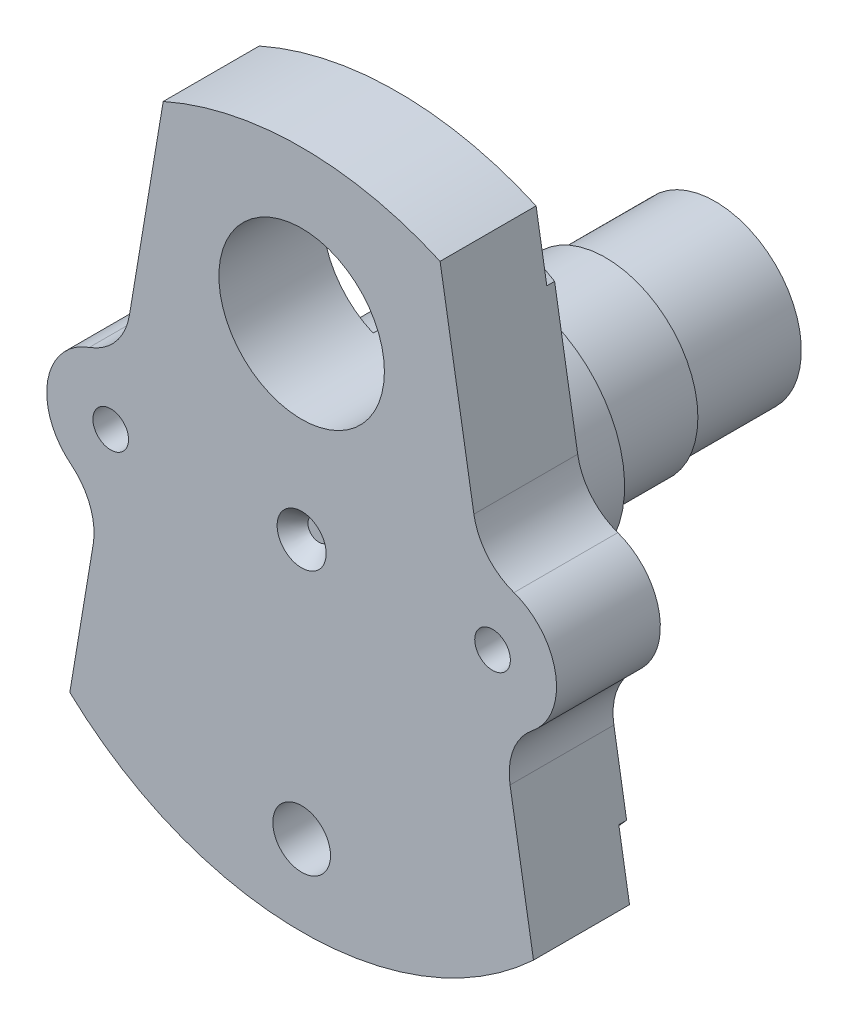
ISO-10303-21;
HEADER;
FILE_DESCRIPTION(('STEP AP214'),'2;1');
FILE_NAME('part.step','',(''),(''),'','','');
FILE_SCHEMA(('AUTOMOTIVE_DESIGN { 1 0 10303 214 1 1 1 1 }'));
ENDSEC;
DATA;
#1=APPLICATION_CONTEXT('core data for automotive mechanical design processes');
#2=APPLICATION_PROTOCOL_DEFINITION('international standard','automotive_design',2000,#1);
#3=PRODUCT_CONTEXT('',#1,'mechanical');
#4=PRODUCT('Part','Part','',(#3));
#5=PRODUCT_RELATED_PRODUCT_CATEGORY('part','',(#4));
#6=PRODUCT_DEFINITION_FORMATION('','',#4);
#7=PRODUCT_DEFINITION_CONTEXT('part definition',#1,'design');
#8=PRODUCT_DEFINITION('design','',#6,#7);
#9=PRODUCT_DEFINITION_SHAPE('','',#8);
#10=(LENGTH_UNIT() NAMED_UNIT(*) SI_UNIT(.MILLI.,.METRE.));
#11=(NAMED_UNIT(*) PLANE_ANGLE_UNIT() SI_UNIT($,.RADIAN.));
#12=(NAMED_UNIT(*) SI_UNIT($,.STERADIAN.) SOLID_ANGLE_UNIT());
#13=UNCERTAINTY_MEASURE_WITH_UNIT(LENGTH_MEASURE(1.E-05),#10,'distance_accuracy_value','');
#14=(GEOMETRIC_REPRESENTATION_CONTEXT(3) GLOBAL_UNCERTAINTY_ASSIGNED_CONTEXT((#13)) GLOBAL_UNIT_ASSIGNED_CONTEXT((#10,
#11,#12)) REPRESENTATION_CONTEXT('',''));
#15=CARTESIAN_POINT('',(0.,0.,0.));
#16=DIRECTION('',(0.,0.,1.));
#17=DIRECTION('',(1.,0.,0.));
#18=AXIS2_PLACEMENT_3D('',#15,#16,#17);
#19=CARTESIAN_POINT('',(36.1365206861808,-18.7744784222295,-18.));
#20=DIRECTION('',(0.986305164893653,0.164930657259661,0.));
#21=DIRECTION('',(-0.164930657259661,0.986305164893653,0.));
#22=AXIS2_PLACEMENT_3D('',#19,#20,#21);
#23=PLANE('',#22);
#24=DIRECTION('',(0.,0.,1.));
#25=VECTOR('',#24,1.);
#26=CARTESIAN_POINT('',(40.1957522810744,-43.0491715209165,-18.));
#27=LINE('',#26,#25);
#28=CARTESIAN_POINT('',(40.1957522810744,-43.0491715209165,-16.65));
#29=VERTEX_POINT('',#28);
#30=CARTESIAN_POINT('',(40.1957522810744,-43.0491715209165,0.));
#31=VERTEX_POINT('',#30);
#32=EDGE_CURVE('E335',#29,#31,#27,.T.);
#33=ORIENTED_EDGE('',*,*,#32,.F.);
#34=DIRECTION('',(-0.164930657259661,0.986305164893653,0.));
#35=VECTOR('',#34,1.);
#36=CARTESIAN_POINT('',(36.1365206861808,-18.7744784222295,-16.65));
#37=LINE('',#36,#35);
#38=CARTESIAN_POINT('',(38.3431689216786,-31.9705002409534,-16.65));
#39=VERTEX_POINT('',#38);
#40=EDGE_CURVE('E213',#29,#39,#37,.T.);
#41=ORIENTED_EDGE('',*,*,#40,.T.);
#42=DIRECTION('',(0.,0.,-1.));
#43=VECTOR('',#42,1.);
#44=CARTESIAN_POINT('',(38.3431689216786,-31.9705002409534,-16.65));
#45=LINE('',#44,#43);
#46=CARTESIAN_POINT('',(38.3431689216787,-31.9705002409534,-18.));
#47=VERTEX_POINT('',#46);
#48=EDGE_CURVE('E387',#39,#47,#45,.T.);
#49=ORIENTED_EDGE('',*,*,#48,.T.);
#50=DIRECTION('',(-0.164930657259661,0.986305164893653,0.));
#51=VECTOR('',#50,1.);
#52=CARTESIAN_POINT('',(36.1365206861808,-18.7744784222295,-18.));
#53=LINE('',#52,#51);
#54=CARTESIAN_POINT('',(36.1365206861808,-18.7744784222295,-18.));
#55=VERTEX_POINT('',#54);
#56=EDGE_CURVE('E294',#47,#55,#53,.T.);
#57=ORIENTED_EDGE('',*,*,#56,.T.);
#58=DIRECTION('',(0.,0.,1.));
#59=VECTOR('',#58,1.);
#60=CARTESIAN_POINT('',(36.1365206861808,-18.7744784222295,-18.));
#61=LINE('',#60,#59);
#62=CARTESIAN_POINT('',(36.1365206861808,-18.7744784222295,0.));
#63=VERTEX_POINT('',#62);
#64=EDGE_CURVE('E245',#55,#63,#61,.T.);
#65=ORIENTED_EDGE('',*,*,#64,.T.);
#66=DIRECTION('',(-0.164930657259661,0.986305164893653,0.));
#67=VECTOR('',#66,1.);
#68=CARTESIAN_POINT('',(36.1365206861808,-18.7744784222295,0.));
#69=LINE('',#68,#67);
#70=EDGE_CURVE('E271',#31,#63,#69,.T.);
#71=ORIENTED_EDGE('',*,*,#70,.F.);
#72=EDGE_LOOP('',(#33,#41,#49,#57,#65,#71));
#73=FACE_BOUND('',#72,.T.);
#74=ADVANCED_FACE('F44',(#73),#23,.T.);
#75=CARTESIAN_POINT('',(0.,0.,-18.));
#76=DIRECTION('',(0.,0.,1.));
#77=DIRECTION('',(1.,0.,0.));
#78=AXIS2_PLACEMENT_3D('',#75,#76,#77);
#79=CYLINDRICAL_SURFACE('',#78,58.8976202412184);
#80=DIRECTION('',(0.,0.,1.));
#81=VECTOR('',#80,1.);
#82=CARTESIAN_POINT('',(-40.1957522810744,-43.0491715209165,-18.));
#83=LINE('',#82,#81);
#84=CARTESIAN_POINT('',(-40.1957522810744,-43.0491715209165,-16.65));
#85=VERTEX_POINT('',#84);
#86=CARTESIAN_POINT('',(-40.1957522810744,-43.0491715209165,0.));
#87=VERTEX_POINT('',#86);
#88=EDGE_CURVE('E331',#85,#87,#83,.T.);
#89=ORIENTED_EDGE('',*,*,#88,.F.);
#90=CARTESIAN_POINT('',(0.,0.,-16.65));
#91=DIRECTION('',(0.,0.,-1.));
#92=DIRECTION('',(-1.,0.,0.));
#93=AXIS2_PLACEMENT_3D('',#90,#91,#92);
#94=CIRCLE('',#93,58.8976202412184);
#95=EDGE_CURVE('E206',#85,#29,#94,.F.);
#96=ORIENTED_EDGE('',*,*,#95,.T.);
#97=ORIENTED_EDGE('',*,*,#32,.T.);
#98=CARTESIAN_POINT('',(0.,0.,0.));
#99=DIRECTION('',(0.,0.,1.));
#100=DIRECTION('',(1.,0.,0.));
#101=AXIS2_PLACEMENT_3D('',#98,#99,#100);
#102=CIRCLE('',#101,58.8976202412184);
#103=EDGE_CURVE('E326',#87,#31,#102,.T.);
#104=ORIENTED_EDGE('',*,*,#103,.F.);
#105=EDGE_LOOP('',(#89,#96,#97,#104));
#106=FACE_BOUND('',#105,.T.);
#107=ADVANCED_FACE('F414',(#106),#79,.T.);
#108=CARTESIAN_POINT('',(-36.1365206861809,-18.7744784222295,-18.));
#109=DIRECTION('',(-0.986305164893653,0.16493065725966,0.));
#110=DIRECTION('',(-0.16493065725966,-0.986305164893653,0.));
#111=AXIS2_PLACEMENT_3D('',#108,#109,#110);
#112=PLANE('',#111);
#113=DIRECTION('',(0.,0.,-1.));
#114=VECTOR('',#113,1.);
#115=CARTESIAN_POINT('',(-38.3431689216786,-31.9705002409534,-16.65));
#116=LINE('',#115,#114);
#117=CARTESIAN_POINT('',(-38.3431689216786,-31.9705002409534,-18.));
#118=VERTEX_POINT('',#117);
#119=CARTESIAN_POINT('',(-38.3431689216786,-31.9705002409534,-16.65));
#120=VERTEX_POINT('',#119);
#121=EDGE_CURVE('E186',#118,#120,#116,.F.);
#122=ORIENTED_EDGE('',*,*,#121,.T.);
#123=DIRECTION('',(-0.16493065725966,-0.986305164893653,0.));
#124=VECTOR('',#123,1.);
#125=CARTESIAN_POINT('',(-36.1365206861809,-18.7744784222295,-16.65));
#126=LINE('',#125,#124);
#127=EDGE_CURVE('E205',#120,#85,#126,.T.);
#128=ORIENTED_EDGE('',*,*,#127,.T.);
#129=ORIENTED_EDGE('',*,*,#88,.T.);
#130=DIRECTION('',(-0.16493065725966,-0.986305164893653,0.));
#131=VECTOR('',#130,1.);
#132=CARTESIAN_POINT('',(-36.1365206861809,-18.7744784222295,0.));
#133=LINE('',#132,#131);
#134=CARTESIAN_POINT('',(-36.1365206861809,-18.7744784222295,0.));
#135=VERTEX_POINT('',#134);
#136=EDGE_CURVE('E323',#135,#87,#133,.T.);
#137=ORIENTED_EDGE('',*,*,#136,.F.);
#138=DIRECTION('',(0.,0.,1.));
#139=VECTOR('',#138,1.);
#140=CARTESIAN_POINT('',(-36.1365206861809,-18.7744784222295,-18.));
#141=LINE('',#140,#139);
#142=CARTESIAN_POINT('',(-36.1365206861809,-18.7744784222295,-18.));
#143=VERTEX_POINT('',#142);
#144=EDGE_CURVE('E338',#143,#135,#141,.T.);
#145=ORIENTED_EDGE('',*,*,#144,.F.);
#146=DIRECTION('',(-0.16493065725966,-0.986305164893653,0.));
#147=VECTOR('',#146,1.);
#148=CARTESIAN_POINT('',(-36.1365206861809,-18.7744784222295,-18.));
#149=LINE('',#148,#147);
#150=EDGE_CURVE('E292',#143,#118,#149,.T.);
#151=ORIENTED_EDGE('',*,*,#150,.T.);
#152=EDGE_LOOP('',(#122,#128,#129,#137,#145,#151));
#153=FACE_BOUND('',#152,.T.);
#154=ADVANCED_FACE('F417',(#153),#112,.T.);
#155=CARTESIAN_POINT('',(-24.0031466517319,53.7845574574546,-18.));
#156=DIRECTION('',(-0.986305164893653,0.164930657259659,0.));
#157=DIRECTION('',(-0.164930657259659,-0.986305164893653,0.));
#158=AXIS2_PLACEMENT_3D('',#155,#156,#157);
#159=PLANE('',#158);
#160=DIRECTION('',(0.,0.,1.));
#161=VECTOR('',#160,1.);
#162=CARTESIAN_POINT('',(-24.0031466517319,53.7845574574546,-18.));
#163=LINE('',#162,#161);
#164=CARTESIAN_POINT('',(-24.0031466517319,53.7845574574546,-16.65));
#165=VERTEX_POINT('',#164);
#166=CARTESIAN_POINT('',(-24.0031466517319,53.7845574574546,0.));
#167=VERTEX_POINT('',#166);
#168=EDGE_CURVE('E203',#165,#167,#163,.T.);
#169=ORIENTED_EDGE('',*,*,#168,.F.);
#170=DIRECTION('',(-0.164930657259659,-0.986305164893653,0.));
#171=VECTOR('',#170,1.);
#172=CARTESIAN_POINT('',(-24.0031466517319,53.7845574574546,-16.65));
#173=LINE('',#172,#171);
#174=CARTESIAN_POINT('',(-25.8557300111277,42.7058861774915,-16.65));
#175=VERTEX_POINT('',#174);
#176=EDGE_CURVE('E192',#165,#175,#173,.T.);
#177=ORIENTED_EDGE('',*,*,#176,.T.);
#178=DIRECTION('',(0.,0.,-1.));
#179=VECTOR('',#178,1.);
#180=CARTESIAN_POINT('',(-25.8557300111276,42.7058861774915,-16.65));
#181=LINE('',#180,#179);
#182=CARTESIAN_POINT('',(-25.8557300111276,42.7058861774915,-18.));
#183=VERTEX_POINT('',#182);
#184=EDGE_CURVE('E180',#175,#183,#181,.T.);
#185=ORIENTED_EDGE('',*,*,#184,.T.);
#186=DIRECTION('',(-0.164930657259659,-0.986305164893653,0.));
#187=VECTOR('',#186,1.);
#188=CARTESIAN_POINT('',(-24.0031466517319,53.7845574574546,-18.));
#189=LINE('',#188,#187);
#190=CARTESIAN_POINT('',(-29.8621091350193,18.747257211408,-18.));
#191=VERTEX_POINT('',#190);
#192=EDGE_CURVE('E278',#183,#191,#189,.T.);
#193=ORIENTED_EDGE('',*,*,#192,.T.);
#194=DIRECTION('',(0.,0.,1.));
#195=VECTOR('',#194,1.);
#196=CARTESIAN_POINT('',(-29.8621091350193,18.747257211408,-18.));
#197=LINE('',#196,#195);
#198=CARTESIAN_POINT('',(-29.8621091350193,18.747257211408,0.));
#199=VERTEX_POINT('',#198);
#200=EDGE_CURVE('E342',#191,#199,#197,.T.);
#201=ORIENTED_EDGE('',*,*,#200,.T.);
#202=DIRECTION('',(-0.164930657259659,-0.986305164893653,0.));
#203=VECTOR('',#202,1.);
#204=CARTESIAN_POINT('',(-24.0031466517319,53.7845574574546,0.));
#205=LINE('',#204,#203);
#206=EDGE_CURVE('E313',#167,#199,#205,.T.);
#207=ORIENTED_EDGE('',*,*,#206,.F.);
#208=EDGE_LOOP('',(#169,#177,#185,#193,#201,#207));
#209=FACE_BOUND('',#208,.T.);
#210=ADVANCED_FACE('F200',(#209),#159,.T.);
#211=CARTESIAN_POINT('',(0.,0.,-18.));
#212=DIRECTION('',(0.,0.,1.));
#213=DIRECTION('',(1.,0.,0.));
#214=AXIS2_PLACEMENT_3D('',#211,#212,#213);
#215=CYLINDRICAL_SURFACE('',#214,58.8976202412184);
#216=DIRECTION('',(0.,0.,1.));
#217=VECTOR('',#216,1.);
#218=CARTESIAN_POINT('',(24.0031466517319,53.7845574574546,-18.));
#219=LINE('',#218,#217);
#220=CARTESIAN_POINT('',(24.0031466517319,53.7845574574546,-16.65));
#221=VERTEX_POINT('',#220);
#222=CARTESIAN_POINT('',(24.0031466517319,53.7845574574546,0.));
#223=VERTEX_POINT('',#222);
#224=EDGE_CURVE('E345',#221,#223,#219,.T.);
#225=ORIENTED_EDGE('',*,*,#224,.F.);
#226=CARTESIAN_POINT('',(0.,0.,-16.65));
#227=DIRECTION('',(0.,0.,-1.));
#228=DIRECTION('',(-1.,0.,0.));
#229=AXIS2_PLACEMENT_3D('',#226,#227,#228);
#230=CIRCLE('',#229,58.8976202412184);
#231=EDGE_CURVE('E201',#221,#165,#230,.F.);
#232=ORIENTED_EDGE('',*,*,#231,.T.);
#233=ORIENTED_EDGE('',*,*,#168,.T.);
#234=CARTESIAN_POINT('',(0.,0.,0.));
#235=DIRECTION('',(0.,0.,1.));
#236=DIRECTION('',(1.,0.,0.));
#237=AXIS2_PLACEMENT_3D('',#234,#235,#236);
#238=CIRCLE('',#237,58.8976202412184);
#239=EDGE_CURVE('E306',#223,#167,#238,.T.);
#240=ORIENTED_EDGE('',*,*,#239,.F.);
#241=EDGE_LOOP('',(#225,#232,#233,#240));
#242=FACE_BOUND('',#241,.T.);
#243=ADVANCED_FACE('F391',(#242),#215,.T.);
#244=CARTESIAN_POINT('',(24.0031466517319,53.7845574574546,-18.));
#245=DIRECTION('',(0.986305164893653,0.16493065725966,0.));
#246=DIRECTION('',(-0.16493065725966,0.986305164893653,0.));
#247=AXIS2_PLACEMENT_3D('',#244,#245,#246);
#248=PLANE('',#247);
#249=DIRECTION('',(0.,0.,-1.));
#250=VECTOR('',#249,1.);
#251=CARTESIAN_POINT('',(25.8557300111276,42.7058861774915,-16.65));
#252=LINE('',#251,#250);
#253=CARTESIAN_POINT('',(25.8557300111276,42.7058861774915,-18.));
#254=VERTEX_POINT('',#253);
#255=CARTESIAN_POINT('',(25.8557300111276,42.7058861774915,-16.65));
#256=VERTEX_POINT('',#255);
#257=EDGE_CURVE('E58',#254,#256,#252,.F.);
#258=ORIENTED_EDGE('',*,*,#257,.T.);
#259=DIRECTION('',(-0.16493065725966,0.986305164893653,0.));
#260=VECTOR('',#259,1.);
#261=CARTESIAN_POINT('',(24.0031466517319,53.7845574574546,-16.65));
#262=LINE('',#261,#260);
#263=EDGE_CURVE('E195',#256,#221,#262,.T.);
#264=ORIENTED_EDGE('',*,*,#263,.T.);
#265=ORIENTED_EDGE('',*,*,#224,.T.);
#266=DIRECTION('',(-0.16493065725966,0.986305164893653,0.));
#267=VECTOR('',#266,1.);
#268=CARTESIAN_POINT('',(24.0031466517319,53.7845574574546,0.));
#269=LINE('',#268,#267);
#270=CARTESIAN_POINT('',(29.8621091350193,18.747257211408,0.));
#271=VERTEX_POINT('',#270);
#272=EDGE_CURVE('E305',#271,#223,#269,.T.);
#273=ORIENTED_EDGE('',*,*,#272,.F.);
#274=DIRECTION('',(0.,0.,1.));
#275=VECTOR('',#274,1.);
#276=CARTESIAN_POINT('',(29.8621091350193,18.747257211408,-18.));
#277=LINE('',#276,#275);
#278=CARTESIAN_POINT('',(29.8621091350193,18.747257211408,-18.));
#279=VERTEX_POINT('',#278);
#280=EDGE_CURVE('E350',#279,#271,#277,.T.);
#281=ORIENTED_EDGE('',*,*,#280,.F.);
#282=DIRECTION('',(-0.16493065725966,0.986305164893653,0.));
#283=VECTOR('',#282,1.);
#284=CARTESIAN_POINT('',(24.0031466517319,53.7845574574546,-18.));
#285=LINE('',#284,#283);
#286=EDGE_CURVE('E280',#279,#254,#285,.T.);
#287=ORIENTED_EDGE('',*,*,#286,.T.);
#288=EDGE_LOOP('',(#258,#264,#265,#273,#281,#287));
#289=FACE_BOUND('',#288,.T.);
#290=ADVANCED_FACE('F386',(#289),#248,.T.);
#291=CARTESIAN_POINT('',(46.6541045117622,-17.0157205094858,-18.));
#292=DIRECTION('',(0.,0.,1.));
#293=DIRECTION('',(1.,0.,0.));
#294=AXIS2_PLACEMENT_3D('',#291,#292,#293);
#295=PLANE('',#294);
#296=CARTESIAN_POINT('',(0.,0.,-18.));
#297=DIRECTION('',(0.,0.,-1.));
#298=DIRECTION('',(-1.,0.,0.));
#299=AXIS2_PLACEMENT_3D('',#296,#297,#298);
#300=CIRCLE('',#299,20.);
#301=CARTESIAN_POINT('',(5.61703536948604,19.1950231481481,-18.));
#302=VERTEX_POINT('',#301);
#303=CARTESIAN_POINT('',(-5.61703536948604,19.1950231481481,-18.));
#304=VERTEX_POINT('',#303);
#305=EDGE_CURVE('E236',#302,#304,#300,.T.);
#306=ORIENTED_EDGE('',*,*,#305,.F.);
#307=CARTESIAN_POINT('',(0.,32.4,-18.));
#308=DIRECTION('',(0.,0.,1.));
#309=DIRECTION('',(1.,0.,0.));
#310=AXIS2_PLACEMENT_3D('',#307,#308,#309);
#311=CIRCLE('',#310,14.35);
#312=EDGE_CURVE('E261',#302,#304,#311,.T.);
#313=ORIENTED_EDGE('',*,*,#312,.T.);
#314=EDGE_LOOP('',(#306,#313));
#315=FACE_BOUND('',#314,.T.);
#316=CARTESIAN_POINT('',(-33.1,0.,-18.));
#317=DIRECTION('',(0.,0.,1.));
#318=DIRECTION('',(1.,0.,0.));
#319=AXIS2_PLACEMENT_3D('',#316,#317,#318);
#320=CIRCLE('',#319,3.09082652817773);
#321=CARTESIAN_POINT('',(-30.0091734718223,0.,-18.));
#322=VERTEX_POINT('',#321);
#323=EDGE_CURVE('E248',#322,#322,#320,.T.);
#324=ORIENTED_EDGE('',*,*,#323,.T.);
#325=EDGE_LOOP('',(#324));
#326=FACE_BOUND('',#325,.T.);
#327=CARTESIAN_POINT('',(33.1,0.,-18.));
#328=DIRECTION('',(0.,0.,1.));
#329=DIRECTION('',(-1.,0.,0.));
#330=AXIS2_PLACEMENT_3D('',#327,#328,#329);
#331=CIRCLE('',#330,3.09082652817772);
#332=CARTESIAN_POINT('',(30.0091734718223,0.,-18.));
#333=VERTEX_POINT('',#332);
#334=EDGE_CURVE('E254',#333,#333,#331,.T.);
#335=ORIENTED_EDGE('',*,*,#334,.T.);
#336=EDGE_LOOP('',(#335));
#337=FACE_BOUND('',#336,.T.);
#338=CARTESIAN_POINT('',(0.,0.,-18.));
#339=DIRECTION('',(0.,0.,-1.));
#340=DIRECTION('',(-1.,0.,0.));
#341=AXIS2_PLACEMENT_3D('',#338,#339,#340);
#342=CIRCLE('',#341,49.9230556818509);
#343=EDGE_CURVE('E184',#183,#254,#342,.T.);
#344=ORIENTED_EDGE('',*,*,#343,.T.);
#345=ORIENTED_EDGE('',*,*,#286,.F.);
#346=CARTESIAN_POINT('',(40.3903600661843,20.5077988852001,-18.));
#347=DIRECTION('',(0.,0.,-1.));
#348=DIRECTION('',(-1.,0.,0.));
#349=AXIS2_PLACEMENT_3D('',#346,#347,#348);
#350=CIRCLE('',#349,10.674435566096);
#351=CARTESIAN_POINT('',(36.8148877410866,10.4499873783564,-18.));
#352=VERTEX_POINT('',#351);
#353=EDGE_CURVE('E273',#352,#279,#350,.T.);
#354=ORIENTED_EDGE('',*,*,#353,.F.);
#355=CARTESIAN_POINT('',(33.1,0.,-18.));
#356=DIRECTION('',(0.,0.,1.));
#357=DIRECTION('',(-1.,0.,0.));
#358=AXIS2_PLACEMENT_3D('',#355,#356,#357);
#359=CIRCLE('',#358,11.0906549462457);
#360=CARTESIAN_POINT('',(40.0100852229209,-8.67486883754763,-18.));
#361=VERTEX_POINT('',#360);
#362=EDGE_CURVE('E269',#361,#352,#359,.T.);
#363=ORIENTED_EDGE('',*,*,#362,.F.);
#364=CARTESIAN_POINT('',(46.6541045117622,-17.0157205094858,-18.));
#365=DIRECTION('',(0.,0.,-1.));
#366=DIRECTION('',(1.,0.,0.));
#367=AXIS2_PLACEMENT_3D('',#364,#365,#366);
#368=CIRCLE('',#367,10.6636203478823);
#369=EDGE_CURVE('E270',#55,#361,#368,.T.);
#370=ORIENTED_EDGE('',*,*,#369,.F.);
#371=ORIENTED_EDGE('',*,*,#56,.F.);
#372=CARTESIAN_POINT('',(0.5511589077302,-49.9200131457476,-18.));
#373=VERTEX_POINT('',#372);
#374=EDGE_CURVE('E373',#47,#373,#342,.T.);
#375=ORIENTED_EDGE('',*,*,#374,.T.);
#376=CARTESIAN_POINT('',(0.00437996724736729,-44.9499997866061,-18.));
#377=DIRECTION('',(0.,0.,1.));
#378=DIRECTION('',(1.,0.,0.));
#379=AXIS2_PLACEMENT_3D('',#376,#377,#378);
#380=CIRCLE('',#379,4.99999999998008);
#381=CARTESIAN_POINT('',(-0.541430397974631,-49.920119608604,-18.));
#382=VERTEX_POINT('',#381);
#383=EDGE_CURVE('E241',#373,#382,#380,.T.);
#384=ORIENTED_EDGE('',*,*,#383,.T.);
#385=EDGE_CURVE('E379',#382,#118,#342,.T.);
#386=ORIENTED_EDGE('',*,*,#385,.T.);
#387=ORIENTED_EDGE('',*,*,#150,.F.);
#388=CARTESIAN_POINT('',(-46.6541045117622,-17.0157205094858,-18.));
#389=DIRECTION('',(0.,0.,-1.));
#390=DIRECTION('',(-1.,0.,0.));
#391=AXIS2_PLACEMENT_3D('',#388,#389,#390);
#392=CIRCLE('',#391,10.6636203478823);
#393=CARTESIAN_POINT('',(-40.0100852229209,-8.67486883754765,-18.));
#394=VERTEX_POINT('',#393);
#395=EDGE_CURVE('E289',#394,#143,#392,.T.);
#396=ORIENTED_EDGE('',*,*,#395,.F.);
#397=CARTESIAN_POINT('',(-33.1,0.,-18.));
#398=DIRECTION('',(0.,0.,1.));
#399=DIRECTION('',(1.,0.,0.));
#400=AXIS2_PLACEMENT_3D('',#397,#398,#399);
#401=CIRCLE('',#400,11.0906549462457);
#402=CARTESIAN_POINT('',(-36.8148877410867,10.4499873783565,-18.));
#403=VERTEX_POINT('',#402);
#404=EDGE_CURVE('E284',#403,#394,#401,.T.);
#405=ORIENTED_EDGE('',*,*,#404,.F.);
#406=CARTESIAN_POINT('',(-40.3903600661843,20.5077988852001,-18.));
#407=DIRECTION('',(0.,0.,-1.));
#408=DIRECTION('',(1.,0.,0.));
#409=AXIS2_PLACEMENT_3D('',#406,#407,#408);
#410=CIRCLE('',#409,10.674435566096);
#411=EDGE_CURVE('E285',#191,#403,#410,.T.);
#412=ORIENTED_EDGE('',*,*,#411,.F.);
#413=ORIENTED_EDGE('',*,*,#192,.F.);
#414=EDGE_LOOP('',(#344,#345,#354,#363,#370,#371,#375,#384,#386,#387,#396,#405,#412,#413));
#415=FACE_BOUND('',#414,.T.);
#416=ADVANCED_FACE('F380',(#315,#326,#337,#415),#295,.F.);
#417=CARTESIAN_POINT('',(0.00437996724736729,-44.9499997866061,-18.));
#418=DIRECTION('',(0.,0.,1.));
#419=DIRECTION('',(1.,0.,0.));
#420=AXIS2_PLACEMENT_3D('',#417,#418,#419);
#421=CYLINDRICAL_SURFACE('',#420,4.99999999998008);
#422=CARTESIAN_POINT('',(0.00437996724736729,-44.9499997866061,0.));
#423=DIRECTION('',(0.,0.,1.));
#424=DIRECTION('',(1.,0.,0.));
#425=AXIS2_PLACEMENT_3D('',#422,#423,#424);
#426=CIRCLE('',#425,4.99999999998008);
#427=CARTESIAN_POINT('',(5.00437996722745,-44.9499997866061,0.));
#428=VERTEX_POINT('',#427);
#429=EDGE_CURVE('E240',#428,#428,#426,.T.);
#430=ORIENTED_EDGE('',*,*,#429,.T.);
#431=EDGE_LOOP('',(#430));
#432=FACE_BOUND('',#431,.T.);
#433=DIRECTION('',(0.,0.,-1.));
#434=VECTOR('',#433,1.);
#435=CARTESIAN_POINT('',(-0.541430397974629,-49.920119608604,-17.325));
#436=LINE('',#435,#434);
#437=CARTESIAN_POINT('',(-0.541430397974631,-49.920119608604,-16.65));
#438=VERTEX_POINT('',#437);
#439=EDGE_CURVE('E12',#382,#438,#436,.F.);
#440=ORIENTED_EDGE('',*,*,#439,.F.);
#441=ORIENTED_EDGE('',*,*,#383,.F.);
#442=DIRECTION('',(0.,0.,-1.));
#443=VECTOR('',#442,1.);
#444=CARTESIAN_POINT('',(0.551158907730199,-49.9200131457476,-17.325));
#445=LINE('',#444,#443);
#446=CARTESIAN_POINT('',(0.551158907730202,-49.9200131457476,-16.65));
#447=VERTEX_POINT('',#446);
#448=EDGE_CURVE('E360',#447,#373,#445,.T.);
#449=ORIENTED_EDGE('',*,*,#448,.F.);
#450=CARTESIAN_POINT('',(0.00437996724736729,-44.9499997866061,-16.65));
#451=DIRECTION('',(0.,0.,-1.));
#452=DIRECTION('',(-1.,0.,0.));
#453=AXIS2_PLACEMENT_3D('',#450,#451,#452);
#454=CIRCLE('',#453,4.99999999998008);
#455=EDGE_CURVE('E52',#438,#447,#454,.F.);
#456=ORIENTED_EDGE('',*,*,#455,.F.);
#457=EDGE_LOOP('',(#440,#441,#449,#456));
#458=FACE_BOUND('',#457,.T.);
#459=ADVANCED_FACE('F367',(#432,#458),#421,.F.);
#460=CARTESIAN_POINT('',(0.,0.,-71.7));
#461=DIRECTION('',(0.,0.,1.));
#462=DIRECTION('',(1.,0.,0.));
#463=AXIS2_PLACEMENT_3D('',#460,#461,#462);
#464=CYLINDRICAL_SURFACE('',#463,16.);
#465=CARTESIAN_POINT('',(0.,0.,-36.));
#466=DIRECTION('',(0.,0.,-1.));
#467=DIRECTION('',(-1.,0.,0.));
#468=AXIS2_PLACEMENT_3D('',#465,#466,#467);
#469=CIRCLE('',#468,16.);
#470=CARTESIAN_POINT('',(16.,0.,-36.));
#471=VERTEX_POINT('',#470);
#472=EDGE_CURVE('E231',#471,#471,#469,.T.);
#473=CARTESIAN_POINT('',(0.,0.,-52.7));
#474=DIRECTION('',(0.,0.,-1.));
#475=DIRECTION('',(-1.,0.,0.));
#476=AXIS2_PLACEMENT_3D('',#473,#474,#475);
#477=CIRCLE('',#476,16.);
#478=CARTESIAN_POINT('',(16.,0.,-52.7));
#479=VERTEX_POINT('',#478);
#480=EDGE_CURVE('E226',#479,#479,#477,.T.);
#481=CARTESIAN_POINT('',(16.,0.,-36.));
#482=CARTESIAN_POINT('',(16.,0.,-36.1739583333333));
#483=CARTESIAN_POINT('',(16.,0.,-36.3479166666667));
#484=CARTESIAN_POINT('',(16.,0.,-36.6958333333333));
#485=CARTESIAN_POINT('',(16.,0.,-36.8697916666667));
#486=CARTESIAN_POINT('',(16.,0.,-37.2177083333333));
#487=CARTESIAN_POINT('',(16.,0.,-37.3916666666667));
#488=CARTESIAN_POINT('',(16.,0.,-37.7395833333333));
#489=CARTESIAN_POINT('',(16.,0.,-37.9135416666667));
#490=CARTESIAN_POINT('',(16.,0.,-38.2614583333333));
#491=CARTESIAN_POINT('',(16.,0.,-38.4354166666667));
#492=CARTESIAN_POINT('',(16.,0.,-38.7833333333333));
#493=CARTESIAN_POINT('',(16.,0.,-38.9572916666667));
#494=CARTESIAN_POINT('',(16.,0.,-39.3052083333333));
#495=CARTESIAN_POINT('',(16.,0.,-39.4791666666667));
#496=CARTESIAN_POINT('',(16.,0.,-39.8270833333333));
#497=CARTESIAN_POINT('',(16.,0.,-40.0010416666667));
#498=CARTESIAN_POINT('',(16.,0.,-40.3489583333333));
#499=CARTESIAN_POINT('',(16.,0.,-40.5229166666667));
#500=CARTESIAN_POINT('',(16.,0.,-40.8708333333333));
#501=CARTESIAN_POINT('',(16.,0.,-41.0447916666667));
#502=CARTESIAN_POINT('',(16.,0.,-41.3927083333333));
#503=CARTESIAN_POINT('',(16.,0.,-41.5666666666667));
#504=CARTESIAN_POINT('',(16.,0.,-41.9145833333333));
#505=CARTESIAN_POINT('',(16.,0.,-42.0885416666667));
#506=CARTESIAN_POINT('',(16.,0.,-42.4364583333333));
#507=CARTESIAN_POINT('',(16.,0.,-42.6104166666667));
#508=CARTESIAN_POINT('',(16.,0.,-42.9583333333333));
#509=CARTESIAN_POINT('',(16.,0.,-43.1322916666667));
#510=CARTESIAN_POINT('',(16.,0.,-43.4802083333333));
#511=CARTESIAN_POINT('',(16.,0.,-43.6541666666667));
#512=CARTESIAN_POINT('',(16.,0.,-44.0020833333333));
#513=CARTESIAN_POINT('',(16.,0.,-44.1760416666667));
#514=CARTESIAN_POINT('',(16.,0.,-44.5239583333333));
#515=CARTESIAN_POINT('',(16.,0.,-44.6979166666667));
#516=CARTESIAN_POINT('',(16.,0.,-45.0458333333333));
#517=CARTESIAN_POINT('',(16.,0.,-45.2197916666667));
#518=CARTESIAN_POINT('',(16.,0.,-45.5677083333333));
#519=CARTESIAN_POINT('',(16.,0.,-45.7416666666667));
#520=CARTESIAN_POINT('',(16.,0.,-46.0895833333333));
#521=CARTESIAN_POINT('',(16.,0.,-46.2635416666667));
#522=CARTESIAN_POINT('',(16.,0.,-46.6114583333333));
#523=CARTESIAN_POINT('',(16.,0.,-46.7854166666667));
#524=CARTESIAN_POINT('',(16.,0.,-47.1333333333333));
#525=CARTESIAN_POINT('',(16.,0.,-47.3072916666667));
#526=CARTESIAN_POINT('',(16.,0.,-47.6552083333333));
#527=CARTESIAN_POINT('',(16.,0.,-47.8291666666667));
#528=CARTESIAN_POINT('',(16.,0.,-48.1770833333333));
#529=CARTESIAN_POINT('',(16.,0.,-48.3510416666667));
#530=CARTESIAN_POINT('',(16.,0.,-48.6989583333333));
#531=CARTESIAN_POINT('',(16.,0.,-48.8729166666667));
#532=CARTESIAN_POINT('',(16.,0.,-49.2208333333333));
#533=CARTESIAN_POINT('',(16.,0.,-49.3947916666667));
#534=CARTESIAN_POINT('',(16.,0.,-49.7427083333333));
#535=CARTESIAN_POINT('',(16.,0.,-49.9166666666667));
#536=CARTESIAN_POINT('',(16.,0.,-50.2645833333333));
#537=CARTESIAN_POINT('',(16.,0.,-50.4385416666667));
#538=CARTESIAN_POINT('',(16.,0.,-50.7864583333333));
#539=CARTESIAN_POINT('',(16.,0.,-50.9604166666667));
#540=CARTESIAN_POINT('',(16.,0.,-51.3083333333333));
#541=CARTESIAN_POINT('',(16.,0.,-51.4822916666667));
#542=CARTESIAN_POINT('',(16.,0.,-51.8302083333333));
#543=CARTESIAN_POINT('',(16.,0.,-52.0041666666667));
#544=CARTESIAN_POINT('',(16.,0.,-52.3520833333333));
#545=CARTESIAN_POINT('',(16.,0.,-52.5260416666667));
#546=CARTESIAN_POINT('',(16.,0.,-52.7));
#547=B_SPLINE_CURVE_WITH_KNOTS('',3,(#481,#482,#483,#484,#485,#486,#487,#488,#489,#490,#491,
#492,#493,#494,#495,#496,#497,#498,#499,#500,#501,#502,#503,#504,#505,#506,#507,#508,#509,#510,
#511,#512,#513,#514,#515,#516,#517,#518,#519,#520,#521,#522,#523,#524,#525,#526,#527,#528,#529,
#530,#531,#532,#533,#534,#535,#536,#537,#538,#539,#540,#541,#542,#543,#544,#545,#546),
.UNSPECIFIED.,.F.,.F.,(4,2,2,2,2,2,2,2,2,2,2,2,2,2,2,2,2,2,2,2,2,2,2,2,2,2,2,2,2,2,2,2,4),(0.,
0.521874999999998,1.04375,1.565625,2.0875,2.609375,3.13125,3.653125,4.175,4.696875,5.21875,
5.74062499999999,6.2625,6.784375,7.30624999999999,7.828125,8.35,8.87187499999999,9.39375,
9.91562499999999,10.4375,10.959375,11.48125,12.003125,12.525,13.046875,13.56875,14.090625,
14.6125,15.134375,15.65625,16.178125,16.7),.UNSPECIFIED.);
#548=EDGE_CURVE('BSEAM456',#471,#479,#547,.T.);
#549=ORIENTED_EDGE('',*,*,#472,.T.);
#550=ORIENTED_EDGE('',*,*,#480,.F.);
#551=ORIENTED_EDGE('',*,*,#548,.T.);
#552=ORIENTED_EDGE('',*,*,#548,.F.);
#553=EDGE_LOOP('',(#549,#551,#550,#552));
#554=FACE_BOUND('',#553,.T.);
#555=ADVANCED_FACE('F456',(#554),#464,.T.);
#556=CARTESIAN_POINT('',(46.6541045117622,-17.0157205094858,-18.));
#557=DIRECTION('',(0.,0.,1.));
#558=DIRECTION('',(1.,0.,0.));
#559=AXIS2_PLACEMENT_3D('',#556,#557,#558);
#560=CYLINDRICAL_SURFACE('',#559,10.6636203478823);
#561=CARTESIAN_POINT('',(46.6541045117622,-17.0157205094858,0.));
#562=DIRECTION('',(0.,0.,-1.));
#563=DIRECTION('',(1.,0.,0.));
#564=AXIS2_PLACEMENT_3D('',#561,#562,#563);
#565=CIRCLE('',#564,10.6636203478823);
#566=CARTESIAN_POINT('',(40.0100852229209,-8.67486883754763,0.));
#567=VERTEX_POINT('',#566);
#568=EDGE_CURVE('E262',#63,#567,#565,.T.);
#569=ORIENTED_EDGE('',*,*,#568,.F.);
#570=ORIENTED_EDGE('',*,*,#64,.F.);
#571=ORIENTED_EDGE('',*,*,#369,.T.);
#572=DIRECTION('',(0.,0.,1.));
#573=VECTOR('',#572,1.);
#574=CARTESIAN_POINT('',(40.0100852229209,-8.67486883754763,-18.));
#575=LINE('',#574,#573);
#576=EDGE_CURVE('E298',#361,#567,#575,.T.);
#577=ORIENTED_EDGE('',*,*,#576,.T.);
#578=EDGE_LOOP('',(#569,#570,#571,#577));
#579=FACE_BOUND('',#578,.T.);
#580=ADVANCED_FACE('F50',(#579),#560,.F.);
#581=CARTESIAN_POINT('',(-46.6541045117622,-17.0157205094858,-18.));
#582=DIRECTION('',(0.,0.,1.));
#583=DIRECTION('',(1.,0.,0.));
#584=AXIS2_PLACEMENT_3D('',#581,#582,#583);
#585=CYLINDRICAL_SURFACE('',#584,10.6636203478823);
#586=CARTESIAN_POINT('',(-46.6541045117622,-17.0157205094858,0.));
#587=DIRECTION('',(0.,0.,-1.));
#588=DIRECTION('',(-1.,0.,0.));
#589=AXIS2_PLACEMENT_3D('',#586,#587,#588);
#590=CIRCLE('',#589,10.6636203478823);
#591=CARTESIAN_POINT('',(-40.0100852229209,-8.67486883754765,0.));
#592=VERTEX_POINT('',#591);
#593=EDGE_CURVE('E319',#592,#135,#590,.T.);
#594=ORIENTED_EDGE('',*,*,#593,.F.);
#595=DIRECTION('',(0.,0.,1.));
#596=VECTOR('',#595,1.);
#597=CARTESIAN_POINT('',(-40.0100852229209,-8.67486883754765,-18.));
#598=LINE('',#597,#596);
#599=EDGE_CURVE('E336',#394,#592,#598,.T.);
#600=ORIENTED_EDGE('',*,*,#599,.F.);
#601=ORIENTED_EDGE('',*,*,#395,.T.);
#602=ORIENTED_EDGE('',*,*,#144,.T.);
#603=EDGE_LOOP('',(#594,#600,#601,#602));
#604=FACE_BOUND('',#603,.T.);
#605=ADVANCED_FACE('F424',(#604),#585,.F.);
#606=CARTESIAN_POINT('',(-33.1,0.,-18.));
#607=DIRECTION('',(0.,0.,1.));
#608=DIRECTION('',(1.,0.,0.));
#609=AXIS2_PLACEMENT_3D('',#606,#607,#608);
#610=CYLINDRICAL_SURFACE('',#609,11.0906549462457);
#611=CARTESIAN_POINT('',(-33.1,0.,0.));
#612=DIRECTION('',(0.,0.,1.));
#613=DIRECTION('',(1.,0.,0.));
#614=AXIS2_PLACEMENT_3D('',#611,#612,#613);
#615=CIRCLE('',#614,11.0906549462457);
#616=CARTESIAN_POINT('',(-36.8148877410867,10.4499873783565,0.));
#617=VERTEX_POINT('',#616);
#618=EDGE_CURVE('E320',#617,#592,#615,.T.);
#619=ORIENTED_EDGE('',*,*,#618,.F.);
#620=DIRECTION('',(0.,0.,1.));
#621=VECTOR('',#620,1.);
#622=CARTESIAN_POINT('',(-36.8148877410867,10.4499873783565,-18.));
#623=LINE('',#622,#621);
#624=EDGE_CURVE('E339',#403,#617,#623,.T.);
#625=ORIENTED_EDGE('',*,*,#624,.F.);
#626=ORIENTED_EDGE('',*,*,#404,.T.);
#627=ORIENTED_EDGE('',*,*,#599,.T.);
#628=EDGE_LOOP('',(#619,#625,#626,#627));
#629=FACE_BOUND('',#628,.T.);
#630=ADVANCED_FACE('F427',(#629),#610,.T.);
#631=CARTESIAN_POINT('',(-40.3903600661843,20.5077988852001,-18.));
#632=DIRECTION('',(0.,0.,1.));
#633=DIRECTION('',(1.,0.,0.));
#634=AXIS2_PLACEMENT_3D('',#631,#632,#633);
#635=CYLINDRICAL_SURFACE('',#634,10.674435566096);
#636=CARTESIAN_POINT('',(-40.3903600661843,20.5077988852001,0.));
#637=DIRECTION('',(0.,0.,-1.));
#638=DIRECTION('',(1.,0.,0.));
#639=AXIS2_PLACEMENT_3D('',#636,#637,#638);
#640=CIRCLE('',#639,10.674435566096);
#641=EDGE_CURVE('E314',#199,#617,#640,.T.);
#642=ORIENTED_EDGE('',*,*,#641,.F.);
#643=ORIENTED_EDGE('',*,*,#200,.F.);
#644=ORIENTED_EDGE('',*,*,#411,.T.);
#645=ORIENTED_EDGE('',*,*,#624,.T.);
#646=EDGE_LOOP('',(#642,#643,#644,#645));
#647=FACE_BOUND('',#646,.T.);
#648=ADVANCED_FACE('F435',(#647),#635,.F.);
#649=CARTESIAN_POINT('',(40.3903600661843,20.5077988852001,-18.));
#650=DIRECTION('',(0.,0.,1.));
#651=DIRECTION('',(1.,0.,0.));
#652=AXIS2_PLACEMENT_3D('',#649,#650,#651);
#653=CYLINDRICAL_SURFACE('',#652,10.674435566096);
#654=CARTESIAN_POINT('',(40.3903600661843,20.5077988852001,0.));
#655=DIRECTION('',(0.,0.,-1.));
#656=DIRECTION('',(-1.,0.,0.));
#657=AXIS2_PLACEMENT_3D('',#654,#655,#656);
#658=CIRCLE('',#657,10.674435566096);
#659=CARTESIAN_POINT('',(36.8148877410866,10.4499873783564,0.));
#660=VERTEX_POINT('',#659);
#661=EDGE_CURVE('E302',#660,#271,#658,.T.);
#662=ORIENTED_EDGE('',*,*,#661,.F.);
#663=DIRECTION('',(0.,0.,1.));
#664=VECTOR('',#663,1.);
#665=CARTESIAN_POINT('',(36.8148877410866,10.4499873783564,-18.));
#666=LINE('',#665,#664);
#667=EDGE_CURVE('E349',#352,#660,#666,.T.);
#668=ORIENTED_EDGE('',*,*,#667,.F.);
#669=ORIENTED_EDGE('',*,*,#353,.T.);
#670=ORIENTED_EDGE('',*,*,#280,.T.);
#671=EDGE_LOOP('',(#662,#668,#669,#670));
#672=FACE_BOUND('',#671,.T.);
#673=ADVANCED_FACE('F402',(#672),#653,.F.);
#674=CARTESIAN_POINT('',(33.1,0.,-18.));
#675=DIRECTION('',(0.,0.,1.));
#676=DIRECTION('',(1.,0.,0.));
#677=AXIS2_PLACEMENT_3D('',#674,#675,#676);
#678=CYLINDRICAL_SURFACE('',#677,11.0906549462457);
#679=CARTESIAN_POINT('',(33.1,0.,0.));
#680=DIRECTION('',(0.,0.,1.));
#681=DIRECTION('',(-1.,0.,0.));
#682=AXIS2_PLACEMENT_3D('',#679,#680,#681);
#683=CIRCLE('',#682,11.0906549462457);
#684=EDGE_CURVE('E297',#567,#660,#683,.T.);
#685=ORIENTED_EDGE('',*,*,#684,.F.);
#686=ORIENTED_EDGE('',*,*,#576,.F.);
#687=ORIENTED_EDGE('',*,*,#362,.T.);
#688=ORIENTED_EDGE('',*,*,#667,.T.);
#689=EDGE_LOOP('',(#685,#686,#687,#688));
#690=FACE_BOUND('',#689,.T.);
#691=ADVANCED_FACE('F404',(#690),#678,.T.);
#692=CARTESIAN_POINT('',(46.6541045117622,-17.0157205094858,0.));
#693=DIRECTION('',(0.,0.,1.));
#694=DIRECTION('',(1.,0.,0.));
#695=AXIS2_PLACEMENT_3D('',#692,#693,#694);
#696=PLANE('',#695);
#697=CARTESIAN_POINT('',(0.,0.,0.));
#698=DIRECTION('',(0.,0.,1.));
#699=DIRECTION('',(1.,0.,0.));
#700=AXIS2_PLACEMENT_3D('',#697,#698,#699);
#701=CIRCLE('',#700,4.25);
#702=CARTESIAN_POINT('',(4.25,0.,0.));
#703=VERTEX_POINT('',#702);
#704=EDGE_CURVE('E216',#703,#703,#701,.T.);
#705=ORIENTED_EDGE('',*,*,#704,.F.);
#706=EDGE_LOOP('',(#705));
#707=FACE_BOUND('',#706,.T.);
#708=ORIENTED_EDGE('',*,*,#429,.F.);
#709=EDGE_LOOP('',(#708));
#710=FACE_BOUND('',#709,.T.);
#711=CARTESIAN_POINT('',(-33.1,0.,0.));
#712=DIRECTION('',(0.,0.,1.));
#713=DIRECTION('',(1.,0.,0.));
#714=AXIS2_PLACEMENT_3D('',#711,#712,#713);
#715=CIRCLE('',#714,3.09082652817773);
#716=CARTESIAN_POINT('',(-30.0091734718223,0.,0.));
#717=VERTEX_POINT('',#716);
#718=EDGE_CURVE('E246',#717,#717,#715,.T.);
#719=ORIENTED_EDGE('',*,*,#718,.F.);
#720=EDGE_LOOP('',(#719));
#721=FACE_BOUND('',#720,.T.);
#722=CARTESIAN_POINT('',(33.1,0.,0.));
#723=DIRECTION('',(0.,0.,1.));
#724=DIRECTION('',(-1.,0.,0.));
#725=AXIS2_PLACEMENT_3D('',#722,#723,#724);
#726=CIRCLE('',#725,3.09082652817772);
#727=CARTESIAN_POINT('',(30.0091734718223,0.,0.));
#728=VERTEX_POINT('',#727);
#729=EDGE_CURVE('E252',#728,#728,#726,.T.);
#730=ORIENTED_EDGE('',*,*,#729,.F.);
#731=EDGE_LOOP('',(#730));
#732=FACE_BOUND('',#731,.T.);
#733=CARTESIAN_POINT('',(0.,32.4,0.));
#734=DIRECTION('',(0.,0.,1.));
#735=DIRECTION('',(1.,0.,0.));
#736=AXIS2_PLACEMENT_3D('',#733,#734,#735);
#737=CIRCLE('',#736,14.35);
#738=CARTESIAN_POINT('',(14.35,32.4,0.));
#739=VERTEX_POINT('',#738);
#740=EDGE_CURVE('E256',#739,#739,#737,.T.);
#741=ORIENTED_EDGE('',*,*,#740,.F.);
#742=EDGE_LOOP('',(#741));
#743=FACE_BOUND('',#742,.T.);
#744=ORIENTED_EDGE('',*,*,#568,.T.);
#745=ORIENTED_EDGE('',*,*,#684,.T.);
#746=ORIENTED_EDGE('',*,*,#661,.T.);
#747=ORIENTED_EDGE('',*,*,#272,.T.);
#748=ORIENTED_EDGE('',*,*,#239,.T.);
#749=ORIENTED_EDGE('',*,*,#206,.T.);
#750=ORIENTED_EDGE('',*,*,#641,.T.);
#751=ORIENTED_EDGE('',*,*,#618,.T.);
#752=ORIENTED_EDGE('',*,*,#593,.T.);
#753=ORIENTED_EDGE('',*,*,#136,.T.);
#754=ORIENTED_EDGE('',*,*,#103,.T.);
#755=ORIENTED_EDGE('',*,*,#70,.T.);
#756=EDGE_LOOP('',(#744,#745,#746,#747,#748,#749,#750,#751,#752,#753,#754,#755));
#757=FACE_BOUND('',#756,.T.);
#758=ADVANCED_FACE('F394',(#707,#710,#721,#732,#743,#757),#696,.T.);
#759=CARTESIAN_POINT('',(0.,32.4,-18.));
#760=DIRECTION('',(0.,0.,1.));
#761=DIRECTION('',(1.,0.,0.));
#762=AXIS2_PLACEMENT_3D('',#759,#760,#761);
#763=CYLINDRICAL_SURFACE('',#762,14.35);
#764=ORIENTED_EDGE('',*,*,#312,.F.);
#765=DIRECTION('',(0.,0.,1.));
#766=VECTOR('',#765,1.);
#767=CARTESIAN_POINT('',(5.61703536948604,19.1950231481481,-11.175));
#768=LINE('',#767,#766);
#769=CARTESIAN_POINT('',(5.61703536948604,19.1950231481481,-22.35));
#770=VERTEX_POINT('',#769);
#771=EDGE_CURVE('E354',#770,#302,#768,.T.);
#772=ORIENTED_EDGE('',*,*,#771,.F.);
#773=CARTESIAN_POINT('',(0.,32.4,-22.35));
#774=DIRECTION('',(0.,0.,1.));
#775=DIRECTION('',(1.,0.,0.));
#776=AXIS2_PLACEMENT_3D('',#773,#774,#775);
#777=CIRCLE('',#776,14.35);
#778=CARTESIAN_POINT('',(-5.61703536948604,19.1950231481481,-22.35));
#779=VERTEX_POINT('',#778);
#780=EDGE_CURVE('E225',#779,#770,#777,.T.);
#781=ORIENTED_EDGE('',*,*,#780,.F.);
#782=DIRECTION('',(0.,0.,1.));
#783=VECTOR('',#782,1.);
#784=CARTESIAN_POINT('',(-5.61703536948604,19.1950231481481,-11.175));
#785=LINE('',#784,#783);
#786=EDGE_CURVE('E357',#304,#779,#785,.F.);
#787=ORIENTED_EDGE('',*,*,#786,.F.);
#788=EDGE_LOOP('',(#764,#772,#781,#787));
#789=FACE_BOUND('',#788,.T.);
#790=ORIENTED_EDGE('',*,*,#740,.T.);
#791=EDGE_LOOP('',(#790));
#792=FACE_BOUND('',#791,.T.);
#793=ADVANCED_FACE('F495',(#789,#792),#763,.F.);
#794=CARTESIAN_POINT('',(33.1,0.,-18.));
#795=DIRECTION('',(0.,0.,1.));
#796=DIRECTION('',(1.,0.,0.));
#797=AXIS2_PLACEMENT_3D('',#794,#795,#796);
#798=CYLINDRICAL_SURFACE('',#797,3.09082652817772);
#799=ORIENTED_EDGE('',*,*,#334,.F.);
#800=EDGE_LOOP('',(#799));
#801=FACE_BOUND('',#800,.T.);
#802=ORIENTED_EDGE('',*,*,#729,.T.);
#803=EDGE_LOOP('',(#802));
#804=FACE_BOUND('',#803,.T.);
#805=ADVANCED_FACE('F488',(#801,#804),#798,.F.);
#806=CARTESIAN_POINT('',(-33.1,0.,-18.));
#807=DIRECTION('',(0.,0.,1.));
#808=DIRECTION('',(1.,0.,0.));
#809=AXIS2_PLACEMENT_3D('',#806,#807,#808);
#810=CYLINDRICAL_SURFACE('',#809,3.09082652817773);
#811=ORIENTED_EDGE('',*,*,#323,.F.);
#812=EDGE_LOOP('',(#811));
#813=FACE_BOUND('',#812,.T.);
#814=ORIENTED_EDGE('',*,*,#718,.T.);
#815=EDGE_LOOP('',(#814));
#816=FACE_BOUND('',#815,.T.);
#817=ADVANCED_FACE('F483',(#813,#816),#810,.F.);
#818=CARTESIAN_POINT('',(0.,0.,-36.));
#819=DIRECTION('',(0.,0.,1.));
#820=DIRECTION('',(1.,0.,0.));
#821=AXIS2_PLACEMENT_3D('',#818,#819,#820);
#822=CYLINDRICAL_SURFACE('',#821,20.);
#823=ORIENTED_EDGE('',*,*,#305,.T.);
#824=ORIENTED_EDGE('',*,*,#786,.T.);
#825=CARTESIAN_POINT('',(0.,0.,-22.35));
#826=DIRECTION('',(0.,0.,1.));
#827=DIRECTION('',(1.,0.,0.));
#828=AXIS2_PLACEMENT_3D('',#825,#826,#827);
#829=CIRCLE('',#828,20.);
#830=EDGE_CURVE('E243',#770,#779,#829,.T.);
#831=ORIENTED_EDGE('',*,*,#830,.F.);
#832=ORIENTED_EDGE('',*,*,#771,.T.);
#833=EDGE_LOOP('',(#823,#824,#831,#832));
#834=FACE_BOUND('',#833,.T.);
#835=CARTESIAN_POINT('',(0.,0.,-36.));
#836=DIRECTION('',(0.,0.,-1.));
#837=DIRECTION('',(-1.,0.,0.));
#838=AXIS2_PLACEMENT_3D('',#835,#836,#837);
#839=CIRCLE('',#838,20.);
#840=CARTESIAN_POINT('',(-20.,0.,-36.));
#841=VERTEX_POINT('',#840);
#842=EDGE_CURVE('E233',#841,#841,#839,.T.);
#843=ORIENTED_EDGE('',*,*,#842,.F.);
#844=EDGE_LOOP('',(#843));
#845=FACE_BOUND('',#844,.T.);
#846=ADVANCED_FACE('F477',(#834,#845),#822,.T.);
#847=CARTESIAN_POINT('',(0.,0.,-36.));
#848=DIRECTION('',(0.,0.,-1.));
#849=DIRECTION('',(-1.,0.,0.));
#850=AXIS2_PLACEMENT_3D('',#847,#848,#849);
#851=PLANE('',#850);
#852=ORIENTED_EDGE('',*,*,#472,.F.);
#853=EDGE_LOOP('',(#852));
#854=FACE_BOUND('',#853,.T.);
#855=ORIENTED_EDGE('',*,*,#842,.T.);
#856=EDGE_LOOP('',(#855));
#857=FACE_BOUND('',#856,.T.);
#858=ADVANCED_FACE('F480',(#854,#857),#851,.T.);
#859=CARTESIAN_POINT('',(0.,0.,-52.7));
#860=DIRECTION('',(0.,0.,-1.));
#861=DIRECTION('',(-1.,0.,0.));
#862=AXIS2_PLACEMENT_3D('',#859,#860,#861);
#863=PLANE('',#862);
#864=CARTESIAN_POINT('',(0.,0.,-52.7));
#865=DIRECTION('',(0.,0.,-1.));
#866=DIRECTION('',(-1.,0.,0.));
#867=AXIS2_PLACEMENT_3D('',#864,#865,#866);
#868=CIRCLE('',#867,14.935);
#869=CARTESIAN_POINT('',(-14.935,0.,-52.7));
#870=VERTEX_POINT('',#869);
#871=EDGE_CURVE('E223',#870,#870,#868,.T.);
#872=ORIENTED_EDGE('',*,*,#871,.F.);
#873=EDGE_LOOP('',(#872));
#874=FACE_BOUND('',#873,.T.);
#875=ORIENTED_EDGE('',*,*,#480,.T.);
#876=EDGE_LOOP('',(#875));
#877=FACE_BOUND('',#876,.T.);
#878=ADVANCED_FACE('F479',(#874,#877),#863,.T.);
#879=CARTESIAN_POINT('',(0.,0.,-52.7));
#880=DIRECTION('',(0.,0.,-1.));
#881=DIRECTION('',(-1.,0.,0.));
#882=AXIS2_PLACEMENT_3D('',#879,#880,#881);
#883=CYLINDRICAL_SURFACE('',#882,14.935);
#884=ORIENTED_EDGE('',*,*,#871,.T.);
#885=EDGE_LOOP('',(#884));
#886=FACE_BOUND('',#885,.T.);
#887=CARTESIAN_POINT('',(0.,0.,-71.7));
#888=DIRECTION('',(0.,0.,-1.));
#889=DIRECTION('',(-1.,0.,0.));
#890=AXIS2_PLACEMENT_3D('',#887,#888,#889);
#891=CIRCLE('',#890,14.935);
#892=CARTESIAN_POINT('',(-14.935,0.,-71.7));
#893=VERTEX_POINT('',#892);
#894=EDGE_CURVE('E221',#893,#893,#891,.T.);
#895=ORIENTED_EDGE('',*,*,#894,.F.);
#896=EDGE_LOOP('',(#895));
#897=FACE_BOUND('',#896,.T.);
#898=ADVANCED_FACE('F543',(#886,#897),#883,.T.);
#899=CARTESIAN_POINT('',(0.,0.,-71.7));
#900=DIRECTION('',(0.,0.,-1.));
#901=DIRECTION('',(-1.,0.,0.));
#902=AXIS2_PLACEMENT_3D('',#899,#900,#901);
#903=PLANE('',#902);
#904=ORIENTED_EDGE('',*,*,#894,.T.);
#905=EDGE_LOOP('',(#904));
#906=FACE_BOUND('',#905,.T.);
#907=ADVANCED_FACE('F474',(#906),#903,.T.);
#908=CARTESIAN_POINT('',(0.,32.4,-22.35));
#909=DIRECTION('',(0.,0.,1.));
#910=DIRECTION('',(1.,0.,0.));
#911=AXIS2_PLACEMENT_3D('',#908,#909,#910);
#912=PLANE('',#911);
#913=ORIENTED_EDGE('',*,*,#830,.T.);
#914=ORIENTED_EDGE('',*,*,#780,.T.);
#915=EDGE_LOOP('',(#913,#914));
#916=FACE_BOUND('',#915,.T.);
#917=ADVANCED_FACE('F529',(#916),#912,.T.);
#918=CARTESIAN_POINT('',(0.,0.,0.));
#919=DIRECTION('',(0.,0.,1.));
#920=DIRECTION('',(1.,0.,0.));
#921=AXIS2_PLACEMENT_3D('',#918,#919,#920);
#922=CONICAL_SURFACE('',#921,4.25,0.663225115757846);
#923=CARTESIAN_POINT('',(0.,0.,-3.));
#924=DIRECTION('',(0.,0.,1.));
#925=DIRECTION('',(1.,0.,0.));
#926=AXIS2_PLACEMENT_3D('',#923,#924,#925);
#927=CIRCLE('',#926,1.90614312047984);
#928=CARTESIAN_POINT('',(1.90614312047984,0.,-3.));
#929=VERTEX_POINT('',#928);
#930=EDGE_CURVE('E218',#929,#929,#927,.T.);
#931=ORIENTED_EDGE('',*,*,#930,.F.);
#932=EDGE_LOOP('',(#931));
#933=FACE_BOUND('',#932,.T.);
#934=ORIENTED_EDGE('',*,*,#704,.T.);
#935=EDGE_LOOP('',(#934));
#936=FACE_BOUND('',#935,.T.);
#937=ADVANCED_FACE('F526',(#933,#936),#922,.F.);
#938=CARTESIAN_POINT('',(0.,0.,-3.));
#939=DIRECTION('',(0.,0.,1.));
#940=DIRECTION('',(1.,0.,0.));
#941=AXIS2_PLACEMENT_3D('',#938,#939,#940);
#942=PLANE('',#941);
#943=ORIENTED_EDGE('',*,*,#930,.T.);
#944=EDGE_LOOP('',(#943));
#945=FACE_BOUND('',#944,.T.);
#946=ADVANCED_FACE('F530',(#945),#942,.T.);
#947=CARTESIAN_POINT('',(0.,0.,-16.65));
#948=DIRECTION('',(0.,0.,-1.));
#949=DIRECTION('',(-1.,0.,0.));
#950=AXIS2_PLACEMENT_3D('',#947,#948,#949);
#951=CYLINDRICAL_SURFACE('',#950,49.9230556818509);
#952=ORIENTED_EDGE('',*,*,#385,.F.);
#953=ORIENTED_EDGE('',*,*,#439,.T.);
#954=CARTESIAN_POINT('',(0.,0.,-16.65));
#955=DIRECTION('',(0.,0.,-1.));
#956=DIRECTION('',(-1.,0.,0.));
#957=AXIS2_PLACEMENT_3D('',#954,#955,#956);
#958=CIRCLE('',#957,49.9230556818509);
#959=EDGE_CURVE('E197',#438,#120,#958,.T.);
#960=ORIENTED_EDGE('',*,*,#959,.T.);
#961=ORIENTED_EDGE('',*,*,#121,.F.);
#962=EDGE_LOOP('',(#952,#953,#960,#961));
#963=FACE_BOUND('',#962,.T.);
#964=ADVANCED_FACE('F420',(#963),#951,.T.);
#965=EDGE_CURVE('E69',#39,#447,#958,.T.);
#966=ORIENTED_EDGE('',*,*,#965,.T.);
#967=ORIENTED_EDGE('',*,*,#448,.T.);
#968=ORIENTED_EDGE('',*,*,#374,.F.);
#969=ORIENTED_EDGE('',*,*,#48,.F.);
#970=EDGE_LOOP('',(#966,#967,#968,#969));
#971=FACE_BOUND('',#970,.T.);
#972=ADVANCED_FACE('F375',(#971),#951,.T.);
#973=CARTESIAN_POINT('',(0.,0.,-16.65));
#974=DIRECTION('',(0.,0.,-1.));
#975=DIRECTION('',(-1.,0.,0.));
#976=AXIS2_PLACEMENT_3D('',#973,#974,#975);
#977=PLANE('',#976);
#978=ORIENTED_EDGE('',*,*,#95,.F.);
#979=ORIENTED_EDGE('',*,*,#127,.F.);
#980=ORIENTED_EDGE('',*,*,#959,.F.);
#981=ORIENTED_EDGE('',*,*,#455,.T.);
#982=ORIENTED_EDGE('',*,*,#965,.F.);
#983=ORIENTED_EDGE('',*,*,#40,.F.);
#984=EDGE_LOOP('',(#978,#979,#980,#981,#982,#983));
#985=FACE_BOUND('',#984,.T.);
#986=ADVANCED_FACE('F364',(#985),#977,.T.);
#987=ORIENTED_EDGE('',*,*,#231,.F.);
#988=ORIENTED_EDGE('',*,*,#263,.F.);
#989=EDGE_CURVE('E181',#175,#256,#958,.T.);
#990=ORIENTED_EDGE('',*,*,#989,.F.);
#991=ORIENTED_EDGE('',*,*,#176,.F.);
#992=EDGE_LOOP('',(#987,#988,#990,#991));
#993=FACE_BOUND('',#992,.T.);
#994=ADVANCED_FACE('F191',(#993),#977,.T.);
#995=ORIENTED_EDGE('',*,*,#989,.T.);
#996=ORIENTED_EDGE('',*,*,#257,.F.);
#997=ORIENTED_EDGE('',*,*,#343,.F.);
#998=ORIENTED_EDGE('',*,*,#184,.F.);
#999=EDGE_LOOP('',(#995,#996,#997,#998));
#1000=FACE_BOUND('',#999,.T.);
#1001=ADVANCED_FACE('F185',(#1000),#951,.T.);
#1002=CLOSED_SHELL('',(#74,#107,#154,#210,#243,#290,#416,#459,#555,#580,#605,#630,#648,#673,
#691,#758,#793,#805,#817,#846,#858,#878,#898,#907,#917,#937,#946,#964,#972,#986,#994,#1001));
#1003=MANIFOLD_SOLID_BREP('B2',#1002);
#1004=ADVANCED_BREP_SHAPE_REPRESENTATION('',(#18,#1003),#14);
#1005=SHAPE_DEFINITION_REPRESENTATION(#9,#1004);
ENDSEC;
END-ISO-10303-21;
